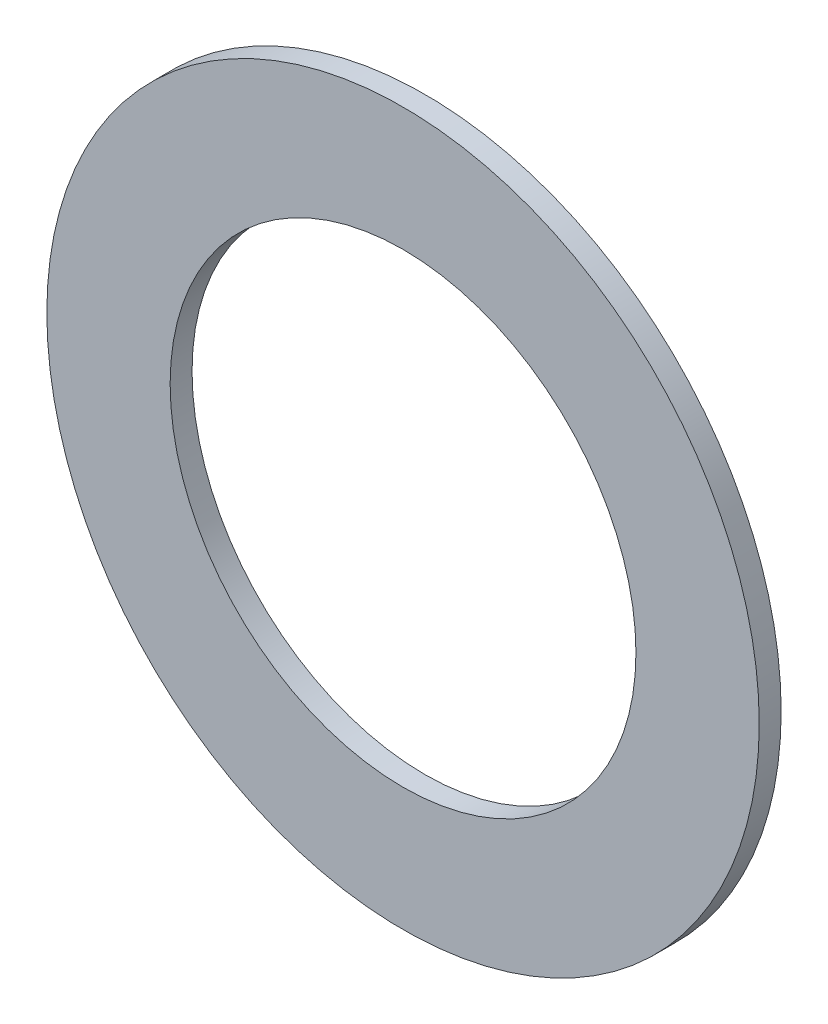
ISO-10303-21;
HEADER;
FILE_DESCRIPTION(('STEP AP214'),'2;1');
FILE_NAME('part.step','',(''),(''),'','','');
FILE_SCHEMA(('AUTOMOTIVE_DESIGN { 1 0 10303 214 1 1 1 1 }'));
ENDSEC;
DATA;
#1=APPLICATION_CONTEXT('core data for automotive mechanical design processes');
#2=APPLICATION_PROTOCOL_DEFINITION('international standard','automotive_design',2000,#1);
#3=PRODUCT_CONTEXT('',#1,'mechanical');
#4=PRODUCT('Part','Part','',(#3));
#5=PRODUCT_RELATED_PRODUCT_CATEGORY('part','',(#4));
#6=PRODUCT_DEFINITION_FORMATION('','',#4);
#7=PRODUCT_DEFINITION_CONTEXT('part definition',#1,'design');
#8=PRODUCT_DEFINITION('design','',#6,#7);
#9=PRODUCT_DEFINITION_SHAPE('','',#8);
#10=(LENGTH_UNIT() NAMED_UNIT(*) SI_UNIT(.MILLI.,.METRE.));
#11=(NAMED_UNIT(*) PLANE_ANGLE_UNIT() SI_UNIT($,.RADIAN.));
#12=(NAMED_UNIT(*) SI_UNIT($,.STERADIAN.) SOLID_ANGLE_UNIT());
#13=UNCERTAINTY_MEASURE_WITH_UNIT(LENGTH_MEASURE(1.E-05),#10,'distance_accuracy_value','');
#14=(GEOMETRIC_REPRESENTATION_CONTEXT(3) GLOBAL_UNCERTAINTY_ASSIGNED_CONTEXT((#13)) GLOBAL_UNIT_ASSIGNED_CONTEXT((#10,
#11,#12)) REPRESENTATION_CONTEXT('',''));
#15=CARTESIAN_POINT('',(0.,0.,0.));
#16=DIRECTION('',(0.,0.,1.));
#17=DIRECTION('',(1.,0.,0.));
#18=AXIS2_PLACEMENT_3D('',#15,#16,#17);
#19=CARTESIAN_POINT('',(0.,0.,2.));
#20=DIRECTION('',(0.,0.,1.));
#21=DIRECTION('',(1.,0.,0.));
#22=AXIS2_PLACEMENT_3D('',#19,#20,#21);
#23=PLANE('',#22);
#24=CARTESIAN_POINT('',(0.,0.,2.));
#25=DIRECTION('',(0.,0.,1.));
#26=DIRECTION('',(1.,0.,0.));
#27=AXIS2_PLACEMENT_3D('',#24,#25,#26);
#28=CIRCLE('',#27,32.5);
#29=CARTESIAN_POINT('',(32.5,0.,2.));
#30=VERTEX_POINT('',#29);
#31=EDGE_CURVE('E10',#30,#30,#28,.T.);
#32=ORIENTED_EDGE('',*,*,#31,.T.);
#33=EDGE_LOOP('',(#32));
#34=FACE_BOUND('',#33,.T.);
#35=CARTESIAN_POINT('',(0.,0.,2.));
#36=DIRECTION('',(0.,0.,1.));
#37=DIRECTION('',(1.,0.,0.));
#38=AXIS2_PLACEMENT_3D('',#35,#36,#37);
#39=CIRCLE('',#38,21.25);
#40=CARTESIAN_POINT('',(21.25,0.,2.));
#41=VERTEX_POINT('',#40);
#42=EDGE_CURVE('E42',#41,#41,#39,.T.);
#43=ORIENTED_EDGE('',*,*,#42,.F.);
#44=EDGE_LOOP('',(#43));
#45=FACE_BOUND('',#44,.T.);
#46=ADVANCED_FACE('F31',(#34,#45),#23,.T.);
#47=CARTESIAN_POINT('',(0.,0.,0.));
#48=DIRECTION('',(0.,0.,1.));
#49=DIRECTION('',(1.,0.,0.));
#50=AXIS2_PLACEMENT_3D('',#47,#48,#49);
#51=PLANE('',#50);
#52=CARTESIAN_POINT('',(0.,0.,0.));
#53=DIRECTION('',(0.,0.,1.));
#54=DIRECTION('',(1.,0.,0.));
#55=AXIS2_PLACEMENT_3D('',#52,#53,#54);
#56=CIRCLE('',#55,32.5);
#57=CARTESIAN_POINT('',(32.5,0.,0.));
#58=VERTEX_POINT('',#57);
#59=EDGE_CURVE('E35',#58,#58,#56,.T.);
#60=ORIENTED_EDGE('',*,*,#59,.F.);
#61=EDGE_LOOP('',(#60));
#62=FACE_BOUND('',#61,.T.);
#63=CARTESIAN_POINT('',(0.,0.,0.));
#64=DIRECTION('',(0.,0.,1.));
#65=DIRECTION('',(1.,0.,0.));
#66=AXIS2_PLACEMENT_3D('',#63,#64,#65);
#67=CIRCLE('',#66,21.25);
#68=CARTESIAN_POINT('',(21.25,0.,0.));
#69=VERTEX_POINT('',#68);
#70=EDGE_CURVE('E44',#69,#69,#67,.T.);
#71=ORIENTED_EDGE('',*,*,#70,.T.);
#72=EDGE_LOOP('',(#71));
#73=FACE_BOUND('',#72,.T.);
#74=ADVANCED_FACE('F54',(#62,#73),#51,.F.);
#75=CARTESIAN_POINT('',(0.,0.,2.));
#76=DIRECTION('',(0.,0.,-1.));
#77=DIRECTION('',(-1.,0.,0.));
#78=AXIS2_PLACEMENT_3D('',#75,#76,#77);
#79=CYLINDRICAL_SURFACE('',#78,32.5);
#80=ORIENTED_EDGE('',*,*,#31,.F.);
#81=EDGE_LOOP('',(#80));
#82=FACE_BOUND('',#81,.T.);
#83=ORIENTED_EDGE('',*,*,#59,.T.);
#84=EDGE_LOOP('',(#83));
#85=FACE_BOUND('',#84,.T.);
#86=ADVANCED_FACE('F33',(#82,#85),#79,.T.);
#87=CARTESIAN_POINT('',(0.,0.,2.));
#88=DIRECTION('',(0.,0.,-1.));
#89=DIRECTION('',(-1.,0.,0.));
#90=AXIS2_PLACEMENT_3D('',#87,#88,#89);
#91=CYLINDRICAL_SURFACE('',#90,21.25);
#92=ORIENTED_EDGE('',*,*,#42,.T.);
#93=EDGE_LOOP('',(#92));
#94=FACE_BOUND('',#93,.T.);
#95=ORIENTED_EDGE('',*,*,#70,.F.);
#96=EDGE_LOOP('',(#95));
#97=FACE_BOUND('',#96,.T.);
#98=ADVANCED_FACE('F50',(#94,#97),#91,.F.);
#99=CLOSED_SHELL('',(#46,#74,#86,#98));
#100=MANIFOLD_SOLID_BREP('B2',#99);
#101=ADVANCED_BREP_SHAPE_REPRESENTATION('',(#18,#100),#14);
#102=SHAPE_DEFINITION_REPRESENTATION(#9,#101);
ENDSEC;
END-ISO-10303-21;
